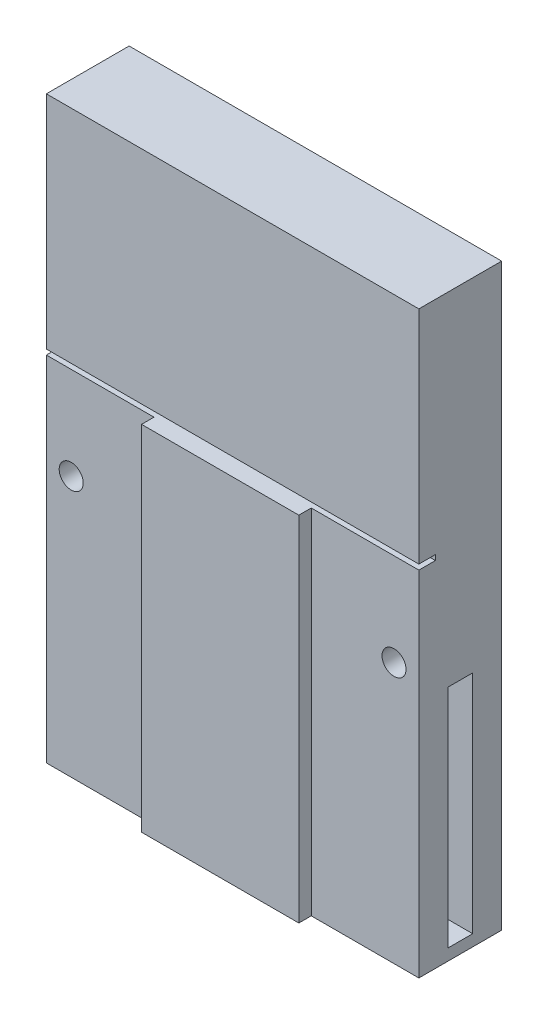
ISO-10303-21;
HEADER;
FILE_DESCRIPTION(('STEP AP214'),'2;1');
FILE_NAME('part.step','',(''),(''),'','','');
FILE_SCHEMA(('AUTOMOTIVE_DESIGN { 1 0 10303 214 1 1 1 1 }'));
ENDSEC;
DATA;
#1=APPLICATION_CONTEXT('core data for automotive mechanical design processes');
#2=APPLICATION_PROTOCOL_DEFINITION('international standard','automotive_design',2000,#1);
#3=PRODUCT_CONTEXT('',#1,'mechanical');
#4=PRODUCT('Part','Part','',(#3));
#5=PRODUCT_RELATED_PRODUCT_CATEGORY('part','',(#4));
#6=PRODUCT_DEFINITION_FORMATION('','',#4);
#7=PRODUCT_DEFINITION_CONTEXT('part definition',#1,'design');
#8=PRODUCT_DEFINITION('design','',#6,#7);
#9=PRODUCT_DEFINITION_SHAPE('','',#8);
#10=(LENGTH_UNIT() NAMED_UNIT(*) SI_UNIT(.MILLI.,.METRE.));
#11=(NAMED_UNIT(*) PLANE_ANGLE_UNIT() SI_UNIT($,.RADIAN.));
#12=(NAMED_UNIT(*) SI_UNIT($,.STERADIAN.) SOLID_ANGLE_UNIT());
#13=UNCERTAINTY_MEASURE_WITH_UNIT(LENGTH_MEASURE(1.E-05),#10,'distance_accuracy_value','');
#14=(GEOMETRIC_REPRESENTATION_CONTEXT(3) GLOBAL_UNCERTAINTY_ASSIGNED_CONTEXT((#13)) GLOBAL_UNIT_ASSIGNED_CONTEXT((#10,
#11,#12)) REPRESENTATION_CONTEXT('',''));
#15=CARTESIAN_POINT('',(0.,0.,0.));
#16=DIRECTION('',(0.,0.,1.));
#17=DIRECTION('',(1.,0.,0.));
#18=AXIS2_PLACEMENT_3D('',#15,#16,#17);
#19=CARTESIAN_POINT('',(22.5,40.,5.));
#20=DIRECTION('',(0.,0.,-1.));
#21=DIRECTION('',(-1.,0.,0.));
#22=AXIS2_PLACEMENT_3D('',#19,#20,#21);
#23=PLANE('',#22);
#24=CARTESIAN_POINT('',(-19.5,11.5,5.));
#25=DIRECTION('',(0.,0.,1.));
#26=DIRECTION('',(1.,0.,0.));
#27=AXIS2_PLACEMENT_3D('',#24,#25,#26);
#28=CIRCLE('',#27,1.45);
#29=CARTESIAN_POINT('',(-18.05,11.5,5.));
#30=VERTEX_POINT('',#29);
#31=EDGE_CURVE('E236',#30,#30,#28,.T.);
#32=ORIENTED_EDGE('',*,*,#31,.F.);
#33=EDGE_LOOP('',(#32));
#34=FACE_BOUND('',#33,.T.);
#35=DIRECTION('',(0.,-1.,0.));
#36=VECTOR('',#35,1.);
#37=CARTESIAN_POINT('',(-9.50000000000001,22.6713275749144,5.));
#38=LINE('',#37,#36);
#39=CARTESIAN_POINT('',(-9.50000000000001,22.6713275749144,5.));
#40=VERTEX_POINT('',#39);
#41=CARTESIAN_POINT('',(-9.5,-20.,5.));
#42=VERTEX_POINT('',#41);
#43=EDGE_CURVE('E192',#40,#42,#38,.T.);
#44=ORIENTED_EDGE('',*,*,#43,.F.);
#45=DIRECTION('',(1.,0.,0.));
#46=VECTOR('',#45,1.);
#47=CARTESIAN_POINT('',(-22.5,22.6713275749144,5.));
#48=LINE('',#47,#46);
#49=CARTESIAN_POINT('',(-22.5,22.6713275749144,5.));
#50=VERTEX_POINT('',#49);
#51=EDGE_CURVE('E229',#50,#40,#48,.T.);
#52=ORIENTED_EDGE('',*,*,#51,.F.);
#53=DIRECTION('',(0.,-1.,0.));
#54=VECTOR('',#53,1.);
#55=CARTESIAN_POINT('',(-22.5,40.,5.00000000000001));
#56=LINE('',#55,#54);
#57=CARTESIAN_POINT('',(-22.5,-20.,5.00000000000001));
#58=VERTEX_POINT('',#57);
#59=EDGE_CURVE('E50',#50,#58,#56,.T.);
#60=ORIENTED_EDGE('',*,*,#59,.T.);
#61=DIRECTION('',(-1.,0.,0.));
#62=VECTOR('',#61,1.);
#63=CARTESIAN_POINT('',(-22.5,-20.,5.00000000000001));
#64=LINE('',#63,#62);
#65=EDGE_CURVE('E258',#42,#58,#64,.T.);
#66=ORIENTED_EDGE('',*,*,#65,.F.);
#67=EDGE_LOOP('',(#44,#52,#60,#66));
#68=FACE_BOUND('',#67,.T.);
#69=ADVANCED_FACE('F41',(#34,#68),#23,.F.);
#70=CARTESIAN_POINT('',(19.5,11.5,5.));
#71=DIRECTION('',(0.,0.,1.));
#72=DIRECTION('',(1.,0.,0.));
#73=AXIS2_PLACEMENT_3D('',#70,#71,#72);
#74=CIRCLE('',#73,1.45);
#75=CARTESIAN_POINT('',(20.95,11.5,5.));
#76=VERTEX_POINT('',#75);
#77=EDGE_CURVE('E243',#76,#76,#74,.T.);
#78=ORIENTED_EDGE('',*,*,#77,.F.);
#79=EDGE_LOOP('',(#78));
#80=FACE_BOUND('',#79,.T.);
#81=DIRECTION('',(0.,1.,0.));
#82=VECTOR('',#81,1.);
#83=CARTESIAN_POINT('',(9.49999999999999,22.6713275749144,5.));
#84=LINE('',#83,#82);
#85=CARTESIAN_POINT('',(9.5,-20.,5.));
#86=VERTEX_POINT('',#85);
#87=CARTESIAN_POINT('',(9.49999999999998,22.6713275749144,5.));
#88=VERTEX_POINT('',#87);
#89=EDGE_CURVE('E200',#86,#88,#84,.T.);
#90=ORIENTED_EDGE('',*,*,#89,.F.);
#91=CARTESIAN_POINT('',(22.5,-20.,5.00000000000001));
#92=VERTEX_POINT('',#91);
#93=EDGE_CURVE('E259',#92,#86,#64,.T.);
#94=ORIENTED_EDGE('',*,*,#93,.F.);
#95=DIRECTION('',(0.,-1.,0.));
#96=VECTOR('',#95,1.);
#97=CARTESIAN_POINT('',(22.5,40.,5.));
#98=LINE('',#97,#96);
#99=CARTESIAN_POINT('',(22.5,22.6713275749144,5.));
#100=VERTEX_POINT('',#99);
#101=EDGE_CURVE('E278',#100,#92,#98,.T.);
#102=ORIENTED_EDGE('',*,*,#101,.F.);
#103=EDGE_CURVE('E216',#88,#100,#48,.T.);
#104=ORIENTED_EDGE('',*,*,#103,.F.);
#105=EDGE_LOOP('',(#90,#94,#102,#104));
#106=FACE_BOUND('',#105,.T.);
#107=ADVANCED_FACE('F308',(#80,#106),#23,.F.);
#108=CARTESIAN_POINT('',(-22.5,50.,5.));
#109=VERTEX_POINT('',#108);
#110=CARTESIAN_POINT('',(-22.5,23.2974929319475,5.));
#111=VERTEX_POINT('',#110);
#112=EDGE_CURVE('E11',#109,#111,#56,.T.);
#113=ORIENTED_EDGE('',*,*,#112,.T.);
#114=DIRECTION('',(-1.,0.,0.));
#115=VECTOR('',#114,1.);
#116=CARTESIAN_POINT('',(-22.5,23.2974929319475,5.));
#117=LINE('',#116,#115);
#118=CARTESIAN_POINT('',(22.5,23.2974929319475,5.));
#119=VERTEX_POINT('',#118);
#120=EDGE_CURVE('E221',#119,#111,#117,.T.);
#121=ORIENTED_EDGE('',*,*,#120,.F.);
#122=CARTESIAN_POINT('',(22.5,50.,5.));
#123=VERTEX_POINT('',#122);
#124=EDGE_CURVE('E279',#123,#119,#98,.T.);
#125=ORIENTED_EDGE('',*,*,#124,.F.);
#126=DIRECTION('',(1.,0.,0.));
#127=VECTOR('',#126,1.);
#128=CARTESIAN_POINT('',(-22.5,50.,5.));
#129=LINE('',#128,#127);
#130=EDGE_CURVE('E265',#109,#123,#129,.T.);
#131=ORIENTED_EDGE('',*,*,#130,.F.);
#132=EDGE_LOOP('',(#113,#121,#125,#131));
#133=FACE_BOUND('',#132,.T.);
#134=ADVANCED_FACE('F310',(#133),#23,.F.);
#135=CARTESIAN_POINT('',(-22.5,40.,-4.99999999999999));
#136=DIRECTION('',(1.,0.,0.));
#137=DIRECTION('',(0.,0.,-1.));
#138=AXIS2_PLACEMENT_3D('',#135,#136,#137);
#139=PLANE('',#138);
#140=DIRECTION('',(0.,-1.,0.));
#141=VECTOR('',#140,1.);
#142=CARTESIAN_POINT('',(-22.5,23.2974929319475,3.));
#143=LINE('',#142,#141);
#144=CARTESIAN_POINT('',(-22.5,23.2974929319475,3.));
#145=VERTEX_POINT('',#144);
#146=CARTESIAN_POINT('',(-22.5,22.6713275749144,3.));
#147=VERTEX_POINT('',#146);
#148=EDGE_CURVE('E217',#145,#147,#143,.T.);
#149=ORIENTED_EDGE('',*,*,#148,.F.);
#150=DIRECTION('',(0.,0.,1.));
#151=VECTOR('',#150,1.);
#152=CARTESIAN_POINT('',(-22.5,23.2974929319475,3.));
#153=LINE('',#152,#151);
#154=EDGE_CURVE('E233',#145,#111,#153,.T.);
#155=ORIENTED_EDGE('',*,*,#154,.T.);
#156=ORIENTED_EDGE('',*,*,#112,.F.);
#157=DIRECTION('',(0.,0.,1.));
#158=VECTOR('',#157,1.);
#159=CARTESIAN_POINT('',(-22.5,50.,-4.99999999999999));
#160=LINE('',#159,#158);
#161=CARTESIAN_POINT('',(-22.5,50.,-4.99999999999999));
#162=VERTEX_POINT('',#161);
#163=EDGE_CURVE('E262',#162,#109,#160,.T.);
#164=ORIENTED_EDGE('',*,*,#163,.F.);
#165=DIRECTION('',(0.,-1.,0.));
#166=VECTOR('',#165,1.);
#167=CARTESIAN_POINT('',(-22.5,40.,-4.99999999999999));
#168=LINE('',#167,#166);
#169=CARTESIAN_POINT('',(-22.5,-20.,-5.));
#170=VERTEX_POINT('',#169);
#171=EDGE_CURVE('E274',#162,#170,#168,.T.);
#172=ORIENTED_EDGE('',*,*,#171,.T.);
#173=DIRECTION('',(0.,0.,-1.));
#174=VECTOR('',#173,1.);
#175=CARTESIAN_POINT('',(-22.5,-20.,5.00000000000001));
#176=LINE('',#175,#174);
#177=EDGE_CURVE('E249',#58,#170,#176,.T.);
#178=ORIENTED_EDGE('',*,*,#177,.F.);
#179=ORIENTED_EDGE('',*,*,#59,.F.);
#180=DIRECTION('',(0.,0.,1.));
#181=VECTOR('',#180,1.);
#182=CARTESIAN_POINT('',(-22.5,22.6713275749144,3.));
#183=LINE('',#182,#181);
#184=EDGE_CURVE('E228',#147,#50,#183,.T.);
#185=ORIENTED_EDGE('',*,*,#184,.F.);
#186=EDGE_LOOP('',(#149,#155,#156,#164,#172,#178,#179,#185));
#187=FACE_BOUND('',#186,.T.);
#188=ADVANCED_FACE('F43',(#187),#139,.F.);
#189=CARTESIAN_POINT('',(22.5,40.,-5.));
#190=DIRECTION('',(-1.,0.,0.));
#191=DIRECTION('',(0.,0.,1.));
#192=AXIS2_PLACEMENT_3D('',#189,#190,#191);
#193=PLANE('',#192);
#194=DIRECTION('',(0.,0.,-1.));
#195=VECTOR('',#194,1.);
#196=CARTESIAN_POINT('',(22.5,-18.6150080325972,1.5));
#197=LINE('',#196,#195);
#198=CARTESIAN_POINT('',(22.5,-18.6150080325973,1.5));
#199=VERTEX_POINT('',#198);
#200=CARTESIAN_POINT('',(22.5,-18.6150080325972,-1.5));
#201=VERTEX_POINT('',#200);
#202=EDGE_CURVE('E186',#199,#201,#197,.T.);
#203=ORIENTED_EDGE('',*,*,#202,.F.);
#204=DIRECTION('',(0.,-1.,0.));
#205=VECTOR('',#204,1.);
#206=CARTESIAN_POINT('',(22.5,8.67132757491439,1.5));
#207=LINE('',#206,#205);
#208=CARTESIAN_POINT('',(22.5,8.67132757491439,1.5));
#209=VERTEX_POINT('',#208);
#210=EDGE_CURVE('E58',#209,#199,#207,.T.);
#211=ORIENTED_EDGE('',*,*,#210,.F.);
#212=DIRECTION('',(0.,0.,1.));
#213=VECTOR('',#212,1.);
#214=CARTESIAN_POINT('',(22.5,8.67132757491439,1.5));
#215=LINE('',#214,#213);
#216=CARTESIAN_POINT('',(22.5,8.67132757491439,-1.5));
#217=VERTEX_POINT('',#216);
#218=EDGE_CURVE('E177',#217,#209,#215,.T.);
#219=ORIENTED_EDGE('',*,*,#218,.F.);
#220=DIRECTION('',(0.,1.,0.));
#221=VECTOR('',#220,1.);
#222=CARTESIAN_POINT('',(22.5,8.67132757491439,-1.5));
#223=LINE('',#222,#221);
#224=EDGE_CURVE('E180',#201,#217,#223,.T.);
#225=ORIENTED_EDGE('',*,*,#224,.F.);
#226=EDGE_LOOP('',(#203,#211,#219,#225));
#227=FACE_BOUND('',#226,.T.);
#228=ORIENTED_EDGE('',*,*,#124,.T.);
#229=DIRECTION('',(0.,0.,1.));
#230=VECTOR('',#229,1.);
#231=CARTESIAN_POINT('',(22.5,23.2974929319475,3.));
#232=LINE('',#231,#230);
#233=CARTESIAN_POINT('',(22.5,23.2974929319475,3.));
#234=VERTEX_POINT('',#233);
#235=EDGE_CURVE('E237',#234,#119,#232,.T.);
#236=ORIENTED_EDGE('',*,*,#235,.F.);
#237=DIRECTION('',(0.,1.,0.));
#238=VECTOR('',#237,1.);
#239=CARTESIAN_POINT('',(22.5,23.2974929319475,3.));
#240=LINE('',#239,#238);
#241=CARTESIAN_POINT('',(22.5,22.6713275749144,3.));
#242=VERTEX_POINT('',#241);
#243=EDGE_CURVE('E223',#242,#234,#240,.T.);
#244=ORIENTED_EDGE('',*,*,#243,.F.);
#245=DIRECTION('',(0.,0.,1.));
#246=VECTOR('',#245,1.);
#247=CARTESIAN_POINT('',(22.5,22.6713275749144,3.));
#248=LINE('',#247,#246);
#249=EDGE_CURVE('E239',#242,#100,#248,.T.);
#250=ORIENTED_EDGE('',*,*,#249,.T.);
#251=ORIENTED_EDGE('',*,*,#101,.T.);
#252=DIRECTION('',(0.,0.,1.));
#253=VECTOR('',#252,1.);
#254=CARTESIAN_POINT('',(22.5,-20.,5.00000000000001));
#255=LINE('',#254,#253);
#256=CARTESIAN_POINT('',(22.5,-20.,-5.));
#257=VERTEX_POINT('',#256);
#258=EDGE_CURVE('E255',#257,#92,#255,.T.);
#259=ORIENTED_EDGE('',*,*,#258,.F.);
#260=DIRECTION('',(0.,-1.,0.));
#261=VECTOR('',#260,1.);
#262=CARTESIAN_POINT('',(22.5,40.,-5.));
#263=LINE('',#262,#261);
#264=CARTESIAN_POINT('',(22.5,50.,-4.99999999999999));
#265=VERTEX_POINT('',#264);
#266=EDGE_CURVE('E276',#265,#257,#263,.T.);
#267=ORIENTED_EDGE('',*,*,#266,.F.);
#268=DIRECTION('',(0.,0.,-1.));
#269=VECTOR('',#268,1.);
#270=CARTESIAN_POINT('',(22.5,50.,-4.99999999999999));
#271=LINE('',#270,#269);
#272=EDGE_CURVE('E268',#123,#265,#271,.T.);
#273=ORIENTED_EDGE('',*,*,#272,.F.);
#274=EDGE_LOOP('',(#228,#236,#244,#250,#251,#259,#267,#273));
#275=FACE_BOUND('',#274,.T.);
#276=ADVANCED_FACE('F323',(#227,#275),#193,.F.);
#277=CARTESIAN_POINT('',(22.5,40.,-5.));
#278=DIRECTION('',(0.,0.,1.));
#279=DIRECTION('',(1.,0.,0.));
#280=AXIS2_PLACEMENT_3D('',#277,#278,#279);
#281=PLANE('',#280);
#282=CARTESIAN_POINT('',(19.5,11.5,-5.));
#283=DIRECTION('',(0.,0.,1.));
#284=DIRECTION('',(1.,0.,0.));
#285=AXIS2_PLACEMENT_3D('',#282,#283,#284);
#286=CIRCLE('',#285,1.45);
#287=CARTESIAN_POINT('',(20.95,11.5,-5.));
#288=VERTEX_POINT('',#287);
#289=EDGE_CURVE('E45',#288,#288,#286,.T.);
#290=ORIENTED_EDGE('',*,*,#289,.T.);
#291=EDGE_LOOP('',(#290));
#292=FACE_BOUND('',#291,.T.);
#293=CARTESIAN_POINT('',(-19.5,11.5,-4.99999999999999));
#294=DIRECTION('',(0.,0.,1.));
#295=DIRECTION('',(1.,0.,0.));
#296=AXIS2_PLACEMENT_3D('',#293,#294,#295);
#297=CIRCLE('',#296,1.45);
#298=CARTESIAN_POINT('',(-18.05,11.5,-4.99999999999999));
#299=VERTEX_POINT('',#298);
#300=EDGE_CURVE('E246',#299,#299,#297,.T.);
#301=ORIENTED_EDGE('',*,*,#300,.T.);
#302=EDGE_LOOP('',(#301));
#303=FACE_BOUND('',#302,.T.);
#304=ORIENTED_EDGE('',*,*,#266,.T.);
#305=DIRECTION('',(1.,0.,0.));
#306=VECTOR('',#305,1.);
#307=CARTESIAN_POINT('',(-22.5,-20.,-5.));
#308=LINE('',#307,#306);
#309=EDGE_CURVE('E252',#170,#257,#308,.T.);
#310=ORIENTED_EDGE('',*,*,#309,.F.);
#311=ORIENTED_EDGE('',*,*,#171,.F.);
#312=DIRECTION('',(-1.,0.,0.));
#313=VECTOR('',#312,1.);
#314=CARTESIAN_POINT('',(-22.5,50.,-4.99999999999999));
#315=LINE('',#314,#313);
#316=EDGE_CURVE('E271',#265,#162,#315,.T.);
#317=ORIENTED_EDGE('',*,*,#316,.F.);
#318=EDGE_LOOP('',(#304,#310,#311,#317));
#319=FACE_BOUND('',#318,.T.);
#320=ADVANCED_FACE('F287',(#292,#303,#319),#281,.F.);
#321=CARTESIAN_POINT('',(0.,50.,0.));
#322=DIRECTION('',(0.,1.,0.));
#323=DIRECTION('',(0.,0.,1.));
#324=AXIS2_PLACEMENT_3D('',#321,#322,#323);
#325=PLANE('',#324);
#326=ORIENTED_EDGE('',*,*,#163,.T.);
#327=ORIENTED_EDGE('',*,*,#130,.T.);
#328=ORIENTED_EDGE('',*,*,#272,.T.);
#329=ORIENTED_EDGE('',*,*,#316,.T.);
#330=EDGE_LOOP('',(#326,#327,#328,#329));
#331=FACE_BOUND('',#330,.T.);
#332=ADVANCED_FACE('F340',(#331),#325,.T.);
#333=CARTESIAN_POINT('',(0.,-20.,0.));
#334=DIRECTION('',(0.,-1.,0.));
#335=DIRECTION('',(0.,0.,-1.));
#336=AXIS2_PLACEMENT_3D('',#333,#334,#335);
#337=PLANE('',#336);
#338=ORIENTED_EDGE('',*,*,#177,.T.);
#339=ORIENTED_EDGE('',*,*,#309,.T.);
#340=ORIENTED_EDGE('',*,*,#258,.T.);
#341=ORIENTED_EDGE('',*,*,#93,.T.);
#342=DIRECTION('',(0.,0.,-1.));
#343=VECTOR('',#342,1.);
#344=CARTESIAN_POINT('',(9.5,-20.,6.5));
#345=LINE('',#344,#343);
#346=CARTESIAN_POINT('',(9.5,-20.,6.5));
#347=VERTEX_POINT('',#346);
#348=EDGE_CURVE('E212',#347,#86,#345,.T.);
#349=ORIENTED_EDGE('',*,*,#348,.F.);
#350=DIRECTION('',(1.,0.,0.));
#351=VECTOR('',#350,1.);
#352=CARTESIAN_POINT('',(-9.5,-20.,6.5));
#353=LINE('',#352,#351);
#354=CARTESIAN_POINT('',(-9.5,-20.,6.5));
#355=VERTEX_POINT('',#354);
#356=EDGE_CURVE('E199',#355,#347,#353,.T.);
#357=ORIENTED_EDGE('',*,*,#356,.F.);
#358=DIRECTION('',(0.,0.,-1.));
#359=VECTOR('',#358,1.);
#360=CARTESIAN_POINT('',(-9.5,-20.,6.5));
#361=LINE('',#360,#359);
#362=EDGE_CURVE('E214',#355,#42,#361,.T.);
#363=ORIENTED_EDGE('',*,*,#362,.T.);
#364=ORIENTED_EDGE('',*,*,#65,.T.);
#365=EDGE_LOOP('',(#338,#339,#340,#341,#349,#357,#363,#364));
#366=FACE_BOUND('',#365,.T.);
#367=ADVANCED_FACE('F303',(#366),#337,.T.);
#368=CARTESIAN_POINT('',(-19.5,11.5,-15.));
#369=DIRECTION('',(0.,0.,1.));
#370=DIRECTION('',(1.,0.,0.));
#371=AXIS2_PLACEMENT_3D('',#368,#369,#370);
#372=CYLINDRICAL_SURFACE('',#371,1.45);
#373=ORIENTED_EDGE('',*,*,#31,.T.);
#374=EDGE_LOOP('',(#373));
#375=FACE_BOUND('',#374,.T.);
#376=ORIENTED_EDGE('',*,*,#300,.F.);
#377=EDGE_LOOP('',(#376));
#378=FACE_BOUND('',#377,.T.);
#379=ADVANCED_FACE('F292',(#375,#378),#372,.F.);
#380=CARTESIAN_POINT('',(19.5,11.5,-15.));
#381=DIRECTION('',(0.,0.,1.));
#382=DIRECTION('',(1.,0.,0.));
#383=AXIS2_PLACEMENT_3D('',#380,#381,#382);
#384=CYLINDRICAL_SURFACE('',#383,1.45);
#385=ORIENTED_EDGE('',*,*,#77,.T.);
#386=EDGE_LOOP('',(#385));
#387=FACE_BOUND('',#386,.T.);
#388=ORIENTED_EDGE('',*,*,#289,.F.);
#389=EDGE_LOOP('',(#388));
#390=FACE_BOUND('',#389,.T.);
#391=ADVANCED_FACE('F289',(#387,#390),#384,.F.);
#392=CARTESIAN_POINT('',(-22.5,23.2974929319475,3.));
#393=DIRECTION('',(0.,1.,0.));
#394=DIRECTION('',(0.,0.,1.));
#395=AXIS2_PLACEMENT_3D('',#392,#393,#394);
#396=PLANE('',#395);
#397=ORIENTED_EDGE('',*,*,#120,.T.);
#398=ORIENTED_EDGE('',*,*,#154,.F.);
#399=DIRECTION('',(-1.,0.,0.));
#400=VECTOR('',#399,1.);
#401=CARTESIAN_POINT('',(-22.5,23.2974929319475,3.));
#402=LINE('',#401,#400);
#403=EDGE_CURVE('E225',#234,#145,#402,.T.);
#404=ORIENTED_EDGE('',*,*,#403,.F.);
#405=ORIENTED_EDGE('',*,*,#235,.T.);
#406=EDGE_LOOP('',(#397,#398,#404,#405));
#407=FACE_BOUND('',#406,.T.);
#408=ADVANCED_FACE('F291',(#407),#396,.F.);
#409=CARTESIAN_POINT('',(-22.5,22.6713275749144,3.));
#410=DIRECTION('',(0.,-1.,0.));
#411=DIRECTION('',(0.,0.,-1.));
#412=AXIS2_PLACEMENT_3D('',#409,#410,#411);
#413=PLANE('',#412);
#414=ORIENTED_EDGE('',*,*,#51,.T.);
#415=DIRECTION('',(0.,0.,-1.));
#416=VECTOR('',#415,1.);
#417=CARTESIAN_POINT('',(-9.50000000000001,22.6713275749144,6.5));
#418=LINE('',#417,#416);
#419=CARTESIAN_POINT('',(-9.50000000000001,22.6713275749144,6.5));
#420=VERTEX_POINT('',#419);
#421=EDGE_CURVE('E206',#420,#40,#418,.T.);
#422=ORIENTED_EDGE('',*,*,#421,.F.);
#423=DIRECTION('',(-1.,0.,0.));
#424=VECTOR('',#423,1.);
#425=CARTESIAN_POINT('',(-9.50000000000001,22.6713275749144,6.5));
#426=LINE('',#425,#424);
#427=CARTESIAN_POINT('',(9.49999999999999,22.6713275749144,6.5));
#428=VERTEX_POINT('',#427);
#429=EDGE_CURVE('E204',#428,#420,#426,.T.);
#430=ORIENTED_EDGE('',*,*,#429,.F.);
#431=DIRECTION('',(0.,0.,-1.));
#432=VECTOR('',#431,1.);
#433=CARTESIAN_POINT('',(9.49999999999999,22.6713275749144,6.5));
#434=LINE('',#433,#432);
#435=EDGE_CURVE('E66',#428,#88,#434,.T.);
#436=ORIENTED_EDGE('',*,*,#435,.T.);
#437=ORIENTED_EDGE('',*,*,#103,.T.);
#438=ORIENTED_EDGE('',*,*,#249,.F.);
#439=DIRECTION('',(1.,0.,0.));
#440=VECTOR('',#439,1.);
#441=CARTESIAN_POINT('',(-22.5,22.6713275749144,3.));
#442=LINE('',#441,#440);
#443=EDGE_CURVE('E220',#147,#242,#442,.T.);
#444=ORIENTED_EDGE('',*,*,#443,.F.);
#445=ORIENTED_EDGE('',*,*,#184,.T.);
#446=EDGE_LOOP('',(#414,#422,#430,#436,#437,#438,#444,#445));
#447=FACE_BOUND('',#446,.T.);
#448=ADVANCED_FACE('F300',(#447),#413,.F.);
#449=CARTESIAN_POINT('',(0.,0.,3.));
#450=DIRECTION('',(0.,0.,1.));
#451=DIRECTION('',(1.,0.,0.));
#452=AXIS2_PLACEMENT_3D('',#449,#450,#451);
#453=PLANE('',#452);
#454=ORIENTED_EDGE('',*,*,#148,.T.);
#455=ORIENTED_EDGE('',*,*,#443,.T.);
#456=ORIENTED_EDGE('',*,*,#243,.T.);
#457=ORIENTED_EDGE('',*,*,#403,.T.);
#458=EDGE_LOOP('',(#454,#455,#456,#457));
#459=FACE_BOUND('',#458,.T.);
#460=ADVANCED_FACE('F333',(#459),#453,.T.);
#461=CARTESIAN_POINT('',(-9.50000000000001,22.6713275749144,6.5));
#462=DIRECTION('',(1.,0.,0.));
#463=DIRECTION('',(0.,1.,0.));
#464=AXIS2_PLACEMENT_3D('',#461,#462,#463);
#465=PLANE('',#464);
#466=ORIENTED_EDGE('',*,*,#43,.T.);
#467=ORIENTED_EDGE('',*,*,#362,.F.);
#468=DIRECTION('',(0.,-1.,0.));
#469=VECTOR('',#468,1.);
#470=CARTESIAN_POINT('',(-9.50000000000001,22.6713275749144,6.5));
#471=LINE('',#470,#469);
#472=EDGE_CURVE('E196',#420,#355,#471,.T.);
#473=ORIENTED_EDGE('',*,*,#472,.F.);
#474=ORIENTED_EDGE('',*,*,#421,.T.);
#475=EDGE_LOOP('',(#466,#467,#473,#474));
#476=FACE_BOUND('',#475,.T.);
#477=ADVANCED_FACE('F366',(#476),#465,.F.);
#478=CARTESIAN_POINT('',(9.49999999999999,22.6713275749144,6.5));
#479=DIRECTION('',(-1.,0.,0.));
#480=DIRECTION('',(0.,-1.,0.));
#481=AXIS2_PLACEMENT_3D('',#478,#479,#480);
#482=PLANE('',#481);
#483=ORIENTED_EDGE('',*,*,#89,.T.);
#484=ORIENTED_EDGE('',*,*,#435,.F.);
#485=DIRECTION('',(0.,1.,0.));
#486=VECTOR('',#485,1.);
#487=CARTESIAN_POINT('',(9.49999999999999,22.6713275749144,6.5));
#488=LINE('',#487,#486);
#489=EDGE_CURVE('E202',#347,#428,#488,.T.);
#490=ORIENTED_EDGE('',*,*,#489,.F.);
#491=ORIENTED_EDGE('',*,*,#348,.T.);
#492=EDGE_LOOP('',(#483,#484,#490,#491));
#493=FACE_BOUND('',#492,.T.);
#494=ADVANCED_FACE('F362',(#493),#482,.F.);
#495=CARTESIAN_POINT('',(0.,0.,6.5));
#496=DIRECTION('',(0.,0.,1.));
#497=DIRECTION('',(1.,0.,0.));
#498=AXIS2_PLACEMENT_3D('',#495,#496,#497);
#499=PLANE('',#498);
#500=ORIENTED_EDGE('',*,*,#472,.T.);
#501=ORIENTED_EDGE('',*,*,#356,.T.);
#502=ORIENTED_EDGE('',*,*,#489,.T.);
#503=ORIENTED_EDGE('',*,*,#429,.T.);
#504=EDGE_LOOP('',(#500,#501,#502,#503));
#505=FACE_BOUND('',#504,.T.);
#506=ADVANCED_FACE('F364',(#505),#499,.T.);
#507=CARTESIAN_POINT('',(12.5,8.67132757491439,1.5));
#508=DIRECTION('',(0.,0.,1.));
#509=DIRECTION('',(1.,0.,0.));
#510=AXIS2_PLACEMENT_3D('',#507,#508,#509);
#511=PLANE('',#510);
#512=ORIENTED_EDGE('',*,*,#210,.T.);
#513=DIRECTION('',(1.,0.,0.));
#514=VECTOR('',#513,1.);
#515=CARTESIAN_POINT('',(12.5,-18.6150080325972,1.5));
#516=LINE('',#515,#514);
#517=CARTESIAN_POINT('',(12.5,-18.6150080325972,1.5));
#518=VERTEX_POINT('',#517);
#519=EDGE_CURVE('E155',#518,#199,#516,.T.);
#520=ORIENTED_EDGE('',*,*,#519,.F.);
#521=DIRECTION('',(0.,-1.,0.));
#522=VECTOR('',#521,1.);
#523=CARTESIAN_POINT('',(12.5,8.67132757491439,1.5));
#524=LINE('',#523,#522);
#525=CARTESIAN_POINT('',(12.5,8.67132757491439,1.5));
#526=VERTEX_POINT('',#525);
#527=EDGE_CURVE('E159',#526,#518,#524,.T.);
#528=ORIENTED_EDGE('',*,*,#527,.F.);
#529=DIRECTION('',(1.,0.,0.));
#530=VECTOR('',#529,1.);
#531=CARTESIAN_POINT('',(12.5,8.67132757491439,1.5));
#532=LINE('',#531,#530);
#533=EDGE_CURVE('E190',#526,#209,#532,.T.);
#534=ORIENTED_EDGE('',*,*,#533,.T.);
#535=EDGE_LOOP('',(#512,#520,#528,#534));
#536=FACE_BOUND('',#535,.T.);
#537=ADVANCED_FACE('F157',(#536),#511,.F.);
#538=CARTESIAN_POINT('',(12.5,8.67132757491439,1.5));
#539=DIRECTION('',(0.,1.,0.));
#540=DIRECTION('',(0.,0.,1.));
#541=AXIS2_PLACEMENT_3D('',#538,#539,#540);
#542=PLANE('',#541);
#543=ORIENTED_EDGE('',*,*,#218,.T.);
#544=ORIENTED_EDGE('',*,*,#533,.F.);
#545=DIRECTION('',(0.,0.,1.));
#546=VECTOR('',#545,1.);
#547=CARTESIAN_POINT('',(12.5,8.67132757491439,1.5));
#548=LINE('',#547,#546);
#549=CARTESIAN_POINT('',(12.5,8.67132757491439,-1.5));
#550=VERTEX_POINT('',#549);
#551=EDGE_CURVE('E165',#550,#526,#548,.T.);
#552=ORIENTED_EDGE('',*,*,#551,.F.);
#553=DIRECTION('',(1.,0.,0.));
#554=VECTOR('',#553,1.);
#555=CARTESIAN_POINT('',(12.5,8.67132757491439,-1.5));
#556=LINE('',#555,#554);
#557=EDGE_CURVE('E193',#550,#217,#556,.T.);
#558=ORIENTED_EDGE('',*,*,#557,.T.);
#559=EDGE_LOOP('',(#543,#544,#552,#558));
#560=FACE_BOUND('',#559,.T.);
#561=ADVANCED_FACE('F425',(#560),#542,.F.);
#562=CARTESIAN_POINT('',(12.5,8.67132757491439,-1.5));
#563=DIRECTION('',(0.,0.,-1.));
#564=DIRECTION('',(-1.,0.,0.));
#565=AXIS2_PLACEMENT_3D('',#562,#563,#564);
#566=PLANE('',#565);
#567=ORIENTED_EDGE('',*,*,#224,.T.);
#568=ORIENTED_EDGE('',*,*,#557,.F.);
#569=DIRECTION('',(0.,1.,0.));
#570=VECTOR('',#569,1.);
#571=CARTESIAN_POINT('',(12.5,8.67132757491439,-1.5));
#572=LINE('',#571,#570);
#573=CARTESIAN_POINT('',(12.5,-18.6150080325972,-1.5));
#574=VERTEX_POINT('',#573);
#575=EDGE_CURVE('E173',#574,#550,#572,.T.);
#576=ORIENTED_EDGE('',*,*,#575,.F.);
#577=DIRECTION('',(1.,0.,0.));
#578=VECTOR('',#577,1.);
#579=CARTESIAN_POINT('',(12.5,-18.6150080325972,-1.5));
#580=LINE('',#579,#578);
#581=EDGE_CURVE('E164',#574,#201,#580,.T.);
#582=ORIENTED_EDGE('',*,*,#581,.T.);
#583=EDGE_LOOP('',(#567,#568,#576,#582));
#584=FACE_BOUND('',#583,.T.);
#585=ADVANCED_FACE('F433',(#584),#566,.F.);
#586=CARTESIAN_POINT('',(12.5,-18.6150080325972,1.5));
#587=DIRECTION('',(0.,-1.,0.));
#588=DIRECTION('',(0.,0.,-1.));
#589=AXIS2_PLACEMENT_3D('',#586,#587,#588);
#590=PLANE('',#589);
#591=ORIENTED_EDGE('',*,*,#202,.T.);
#592=ORIENTED_EDGE('',*,*,#581,.F.);
#593=DIRECTION('',(0.,0.,-1.));
#594=VECTOR('',#593,1.);
#595=CARTESIAN_POINT('',(12.5,-18.6150080325972,1.5));
#596=LINE('',#595,#594);
#597=EDGE_CURVE('E168',#518,#574,#596,.T.);
#598=ORIENTED_EDGE('',*,*,#597,.F.);
#599=ORIENTED_EDGE('',*,*,#519,.T.);
#600=EDGE_LOOP('',(#591,#592,#598,#599));
#601=FACE_BOUND('',#600,.T.);
#602=ADVANCED_FACE('F169',(#601),#590,.F.);
#603=CARTESIAN_POINT('',(12.5,0.,0.));
#604=DIRECTION('',(1.,0.,0.));
#605=DIRECTION('',(0.,0.,-1.));
#606=AXIS2_PLACEMENT_3D('',#603,#604,#605);
#607=PLANE('',#606);
#608=ORIENTED_EDGE('',*,*,#527,.T.);
#609=ORIENTED_EDGE('',*,*,#597,.T.);
#610=ORIENTED_EDGE('',*,*,#575,.T.);
#611=ORIENTED_EDGE('',*,*,#551,.T.);
#612=EDGE_LOOP('',(#608,#609,#610,#611));
#613=FACE_BOUND('',#612,.T.);
#614=ADVANCED_FACE('F175',(#613),#607,.T.);
#615=CLOSED_SHELL('',(#69,#107,#134,#188,#276,#320,#332,#367,#379,#391,#408,#448,#460,#477,#494,
#506,#537,#561,#585,#602,#614));
#616=MANIFOLD_SOLID_BREP('B2',#615);
#617=ADVANCED_BREP_SHAPE_REPRESENTATION('',(#18,#616),#14);
#618=SHAPE_DEFINITION_REPRESENTATION(#9,#617);
ENDSEC;
END-ISO-10303-21;
